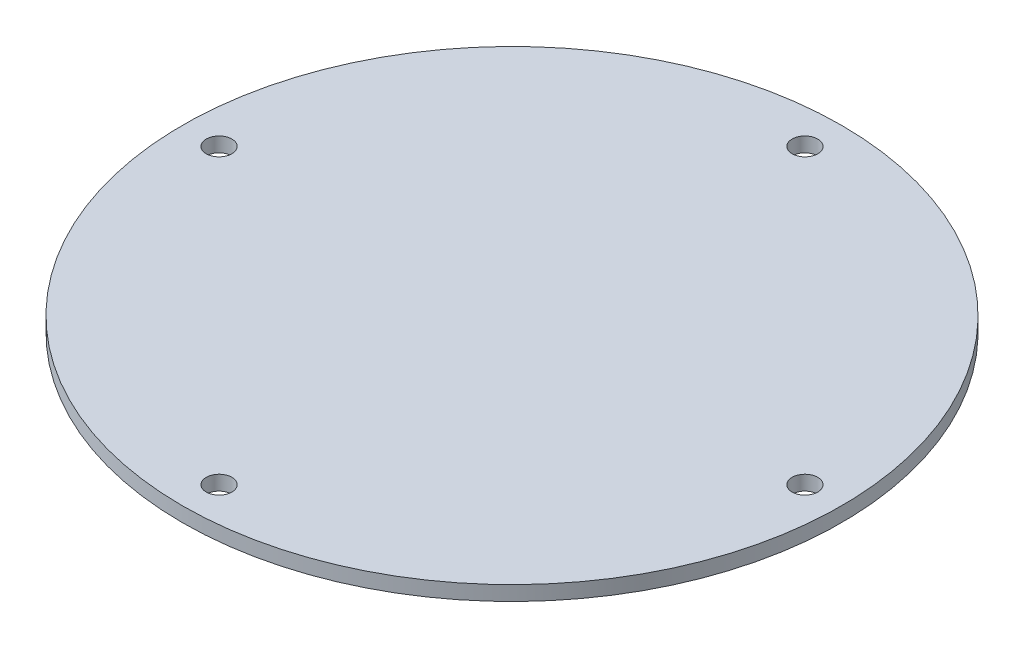
ISO-10303-21;
HEADER;
FILE_DESCRIPTION(('STEP AP214'),'2;1');
FILE_NAME('part.step','',(''),(''),'','','');
FILE_SCHEMA(('AUTOMOTIVE_DESIGN { 1 0 10303 214 1 1 1 1 }'));
ENDSEC;
DATA;
#1=APPLICATION_CONTEXT('core data for automotive mechanical design processes');
#2=APPLICATION_PROTOCOL_DEFINITION('international standard','automotive_design',2000,#1);
#3=PRODUCT_CONTEXT('',#1,'mechanical');
#4=PRODUCT('Part','Part','',(#3));
#5=PRODUCT_RELATED_PRODUCT_CATEGORY('part','',(#4));
#6=PRODUCT_DEFINITION_FORMATION('','',#4);
#7=PRODUCT_DEFINITION_CONTEXT('part definition',#1,'design');
#8=PRODUCT_DEFINITION('design','',#6,#7);
#9=PRODUCT_DEFINITION_SHAPE('','',#8);
#10=(LENGTH_UNIT() NAMED_UNIT(*) SI_UNIT(.MILLI.,.METRE.));
#11=(NAMED_UNIT(*) PLANE_ANGLE_UNIT() SI_UNIT($,.RADIAN.));
#12=(NAMED_UNIT(*) SI_UNIT($,.STERADIAN.) SOLID_ANGLE_UNIT());
#13=UNCERTAINTY_MEASURE_WITH_UNIT(LENGTH_MEASURE(1.E-05),#10,'distance_accuracy_value','');
#14=(GEOMETRIC_REPRESENTATION_CONTEXT(3) GLOBAL_UNCERTAINTY_ASSIGNED_CONTEXT((#13)) GLOBAL_UNIT_ASSIGNED_CONTEXT((#10,
#11,#12)) REPRESENTATION_CONTEXT('',''));
#15=CARTESIAN_POINT('',(0.,0.,0.));
#16=DIRECTION('',(0.,0.,1.));
#17=DIRECTION('',(1.,0.,0.));
#18=AXIS2_PLACEMENT_3D('',#15,#16,#17);
#19=CARTESIAN_POINT('',(0.,2.,0.));
#20=DIRECTION('',(0.,-1.,0.));
#21=DIRECTION('',(0.,0.,-1.));
#22=AXIS2_PLACEMENT_3D('',#19,#20,#21);
#23=CYLINDRICAL_SURFACE('',#22,45.);
#24=CARTESIAN_POINT('',(0.,2.,0.));
#25=DIRECTION('',(0.,1.,0.));
#26=DIRECTION('',(0.,0.,1.));
#27=AXIS2_PLACEMENT_3D('',#24,#25,#26);
#28=CIRCLE('',#27,45.);
#29=CARTESIAN_POINT('',(0.,2.,45.));
#30=VERTEX_POINT('',#29);
#31=EDGE_CURVE('E10',#30,#30,#28,.T.);
#32=ORIENTED_EDGE('',*,*,#31,.F.);
#33=EDGE_LOOP('',(#32));
#34=FACE_BOUND('',#33,.T.);
#35=CARTESIAN_POINT('',(0.,0.,0.));
#36=DIRECTION('',(0.,1.,0.));
#37=DIRECTION('',(0.,0.,1.));
#38=AXIS2_PLACEMENT_3D('',#35,#36,#37);
#39=CIRCLE('',#38,45.);
#40=CARTESIAN_POINT('',(0.,0.,45.));
#41=VERTEX_POINT('',#40);
#42=EDGE_CURVE('E48',#41,#41,#39,.T.);
#43=ORIENTED_EDGE('',*,*,#42,.T.);
#44=EDGE_LOOP('',(#43));
#45=FACE_BOUND('',#44,.T.);
#46=ADVANCED_FACE('F45',(#34,#45),#23,.T.);
#47=CARTESIAN_POINT('',(0.,2.,0.));
#48=DIRECTION('',(0.,1.,0.));
#49=DIRECTION('',(0.,0.,1.));
#50=AXIS2_PLACEMENT_3D('',#47,#48,#49);
#51=PLANE('',#50);
#52=CARTESIAN_POINT('',(0.,2.,-40.));
#53=DIRECTION('',(0.,1.,0.));
#54=DIRECTION('',(0.,0.,1.));
#55=AXIS2_PLACEMENT_3D('',#52,#53,#54);
#56=CIRCLE('',#55,1.75);
#57=CARTESIAN_POINT('',(0.,2.,-38.25));
#58=VERTEX_POINT('',#57);
#59=EDGE_CURVE('E83',#58,#58,#56,.T.);
#60=ORIENTED_EDGE('',*,*,#59,.F.);
#61=EDGE_LOOP('',(#60));
#62=FACE_BOUND('',#61,.T.);
#63=CARTESIAN_POINT('',(40.,2.,0.));
#64=DIRECTION('',(0.,1.,0.));
#65=DIRECTION('',(0.,0.,1.));
#66=AXIS2_PLACEMENT_3D('',#63,#64,#65);
#67=CIRCLE('',#66,1.75);
#68=CARTESIAN_POINT('',(40.,2.,1.75));
#69=VERTEX_POINT('',#68);
#70=EDGE_CURVE('E79',#69,#69,#67,.T.);
#71=ORIENTED_EDGE('',*,*,#70,.F.);
#72=EDGE_LOOP('',(#71));
#73=FACE_BOUND('',#72,.T.);
#74=CARTESIAN_POINT('',(0.,2.,40.));
#75=DIRECTION('',(0.,1.,0.));
#76=DIRECTION('',(0.,0.,1.));
#77=AXIS2_PLACEMENT_3D('',#74,#75,#76);
#78=CIRCLE('',#77,1.75);
#79=CARTESIAN_POINT('',(0.,2.,41.75));
#80=VERTEX_POINT('',#79);
#81=EDGE_CURVE('E71',#80,#80,#78,.T.);
#82=ORIENTED_EDGE('',*,*,#81,.F.);
#83=EDGE_LOOP('',(#82));
#84=FACE_BOUND('',#83,.T.);
#85=CARTESIAN_POINT('',(-40.,2.,0.));
#86=DIRECTION('',(0.,1.,0.));
#87=DIRECTION('',(0.,0.,1.));
#88=AXIS2_PLACEMENT_3D('',#85,#86,#87);
#89=CIRCLE('',#88,1.75);
#90=CARTESIAN_POINT('',(-40.,2.,1.75));
#91=VERTEX_POINT('',#90);
#92=EDGE_CURVE('E63',#91,#91,#89,.T.);
#93=ORIENTED_EDGE('',*,*,#92,.F.);
#94=EDGE_LOOP('',(#93));
#95=FACE_BOUND('',#94,.T.);
#96=ORIENTED_EDGE('',*,*,#31,.T.);
#97=EDGE_LOOP('',(#96));
#98=FACE_BOUND('',#97,.T.);
#99=ADVANCED_FACE('F101',(#62,#73,#84,#95,#98),#51,.T.);
#100=CARTESIAN_POINT('',(0.,0.,0.));
#101=DIRECTION('',(0.,1.,0.));
#102=DIRECTION('',(0.,0.,1.));
#103=AXIS2_PLACEMENT_3D('',#100,#101,#102);
#104=PLANE('',#103);
#105=CARTESIAN_POINT('',(0.,0.,-40.));
#106=DIRECTION('',(0.,1.,0.));
#107=DIRECTION('',(0.,0.,1.));
#108=AXIS2_PLACEMENT_3D('',#105,#106,#107);
#109=CIRCLE('',#108,1.75);
#110=CARTESIAN_POINT('',(0.,0.,-38.25));
#111=VERTEX_POINT('',#110);
#112=EDGE_CURVE('E57',#111,#111,#109,.T.);
#113=ORIENTED_EDGE('',*,*,#112,.T.);
#114=EDGE_LOOP('',(#113));
#115=FACE_BOUND('',#114,.T.);
#116=CARTESIAN_POINT('',(40.,0.,0.));
#117=DIRECTION('',(0.,1.,0.));
#118=DIRECTION('',(0.,0.,1.));
#119=AXIS2_PLACEMENT_3D('',#116,#117,#118);
#120=CIRCLE('',#119,1.75);
#121=CARTESIAN_POINT('',(40.,0.,1.75));
#122=VERTEX_POINT('',#121);
#123=EDGE_CURVE('E75',#122,#122,#120,.T.);
#124=ORIENTED_EDGE('',*,*,#123,.T.);
#125=EDGE_LOOP('',(#124));
#126=FACE_BOUND('',#125,.T.);
#127=CARTESIAN_POINT('',(0.,0.,40.));
#128=DIRECTION('',(0.,1.,0.));
#129=DIRECTION('',(0.,0.,1.));
#130=AXIS2_PLACEMENT_3D('',#127,#128,#129);
#131=CIRCLE('',#130,1.75);
#132=CARTESIAN_POINT('',(0.,0.,41.75));
#133=VERTEX_POINT('',#132);
#134=EDGE_CURVE('E67',#133,#133,#131,.T.);
#135=ORIENTED_EDGE('',*,*,#134,.T.);
#136=EDGE_LOOP('',(#135));
#137=FACE_BOUND('',#136,.T.);
#138=CARTESIAN_POINT('',(-40.,0.,0.));
#139=DIRECTION('',(0.,1.,0.));
#140=DIRECTION('',(0.,0.,1.));
#141=AXIS2_PLACEMENT_3D('',#138,#139,#140);
#142=CIRCLE('',#141,1.75);
#143=CARTESIAN_POINT('',(-40.,0.,1.75));
#144=VERTEX_POINT('',#143);
#145=EDGE_CURVE('E59',#144,#144,#142,.T.);
#146=ORIENTED_EDGE('',*,*,#145,.T.);
#147=EDGE_LOOP('',(#146));
#148=FACE_BOUND('',#147,.T.);
#149=ORIENTED_EDGE('',*,*,#42,.F.);
#150=EDGE_LOOP('',(#149));
#151=FACE_BOUND('',#150,.T.);
#152=ADVANCED_FACE('F91',(#115,#126,#137,#148,#151),#104,.F.);
#153=CARTESIAN_POINT('',(-40.,0.,0.));
#154=DIRECTION('',(0.,1.,0.));
#155=DIRECTION('',(0.,0.,1.));
#156=AXIS2_PLACEMENT_3D('',#153,#154,#155);
#157=CYLINDRICAL_SURFACE('',#156,1.75);
#158=ORIENTED_EDGE('',*,*,#145,.F.);
#159=EDGE_LOOP('',(#158));
#160=FACE_BOUND('',#159,.T.);
#161=ORIENTED_EDGE('',*,*,#92,.T.);
#162=EDGE_LOOP('',(#161));
#163=FACE_BOUND('',#162,.T.);
#164=ADVANCED_FACE('F111',(#160,#163),#157,.F.);
#165=CARTESIAN_POINT('',(0.,0.,40.));
#166=DIRECTION('',(0.,1.,0.));
#167=DIRECTION('',(0.,0.,1.));
#168=AXIS2_PLACEMENT_3D('',#165,#166,#167);
#169=CYLINDRICAL_SURFACE('',#168,1.75);
#170=ORIENTED_EDGE('',*,*,#134,.F.);
#171=EDGE_LOOP('',(#170));
#172=FACE_BOUND('',#171,.T.);
#173=ORIENTED_EDGE('',*,*,#81,.T.);
#174=EDGE_LOOP('',(#173));
#175=FACE_BOUND('',#174,.T.);
#176=ADVANCED_FACE('F113',(#172,#175),#169,.F.);
#177=CARTESIAN_POINT('',(40.,0.,0.));
#178=DIRECTION('',(0.,1.,0.));
#179=DIRECTION('',(0.,0.,1.));
#180=AXIS2_PLACEMENT_3D('',#177,#178,#179);
#181=CYLINDRICAL_SURFACE('',#180,1.75);
#182=ORIENTED_EDGE('',*,*,#123,.F.);
#183=EDGE_LOOP('',(#182));
#184=FACE_BOUND('',#183,.T.);
#185=ORIENTED_EDGE('',*,*,#70,.T.);
#186=EDGE_LOOP('',(#185));
#187=FACE_BOUND('',#186,.T.);
#188=ADVANCED_FACE('F97',(#184,#187),#181,.F.);
#189=CARTESIAN_POINT('',(0.,0.,-40.));
#190=DIRECTION('',(0.,1.,0.));
#191=DIRECTION('',(0.,0.,1.));
#192=AXIS2_PLACEMENT_3D('',#189,#190,#191);
#193=CYLINDRICAL_SURFACE('',#192,1.75);
#194=ORIENTED_EDGE('',*,*,#112,.F.);
#195=EDGE_LOOP('',(#194));
#196=FACE_BOUND('',#195,.T.);
#197=ORIENTED_EDGE('',*,*,#59,.T.);
#198=EDGE_LOOP('',(#197));
#199=FACE_BOUND('',#198,.T.);
#200=ADVANCED_FACE('F94',(#196,#199),#193,.F.);
#201=CLOSED_SHELL('',(#46,#99,#152,#164,#176,#188,#200));
#202=MANIFOLD_SOLID_BREP('B2',#201);
#203=ADVANCED_BREP_SHAPE_REPRESENTATION('',(#18,#202),#14);
#204=SHAPE_DEFINITION_REPRESENTATION(#9,#203);
ENDSEC;
END-ISO-10303-21;
